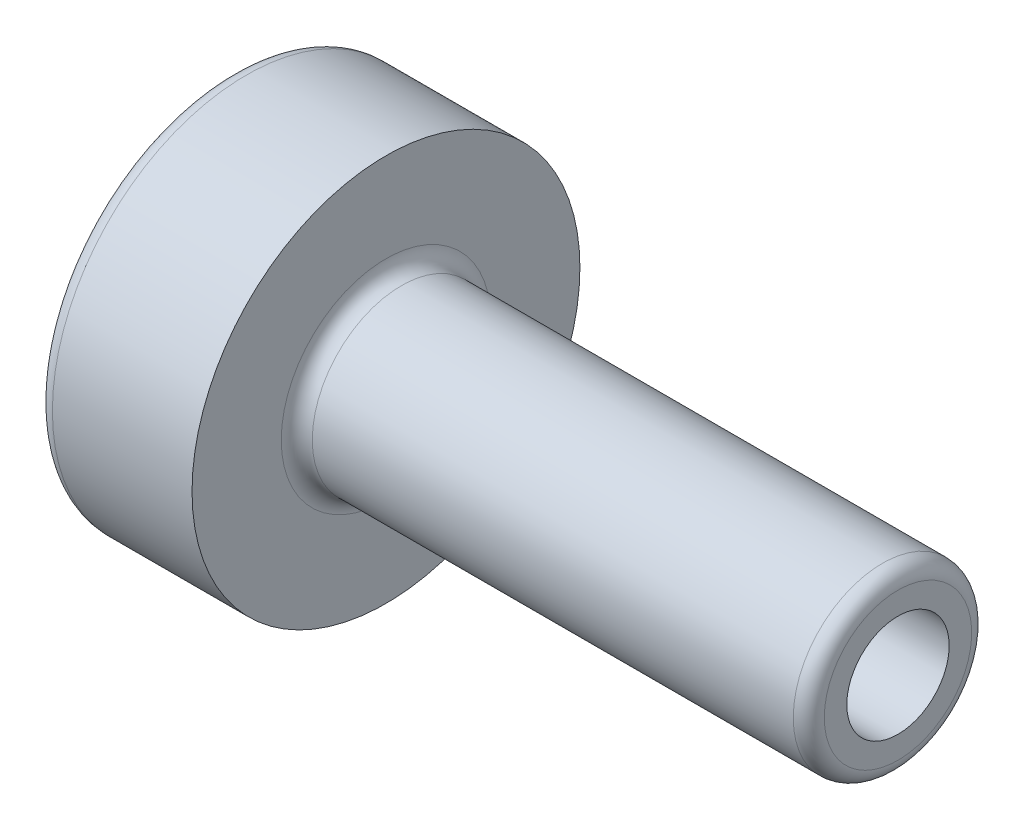
ISO-10303-21;
HEADER;
FILE_DESCRIPTION(('STEP AP214'),'2;1');
FILE_NAME('part.step','',(''),(''),'','','');
FILE_SCHEMA(('AUTOMOTIVE_DESIGN { 1 0 10303 214 1 1 1 1 }'));
ENDSEC;
DATA;
#1=APPLICATION_CONTEXT('core data for automotive mechanical design processes');
#2=APPLICATION_PROTOCOL_DEFINITION('international standard','automotive_design',2000,#1);
#3=PRODUCT_CONTEXT('',#1,'mechanical');
#4=PRODUCT('Part','Part','',(#3));
#5=PRODUCT_RELATED_PRODUCT_CATEGORY('part','',(#4));
#6=PRODUCT_DEFINITION_FORMATION('','',#4);
#7=PRODUCT_DEFINITION_CONTEXT('part definition',#1,'design');
#8=PRODUCT_DEFINITION('design','',#6,#7);
#9=PRODUCT_DEFINITION_SHAPE('','',#8);
#10=(LENGTH_UNIT() NAMED_UNIT(*) SI_UNIT(.MILLI.,.METRE.));
#11=(NAMED_UNIT(*) PLANE_ANGLE_UNIT() SI_UNIT($,.RADIAN.));
#12=(NAMED_UNIT(*) SI_UNIT($,.STERADIAN.) SOLID_ANGLE_UNIT());
#13=UNCERTAINTY_MEASURE_WITH_UNIT(LENGTH_MEASURE(1.E-05),#10,'distance_accuracy_value','');
#14=(GEOMETRIC_REPRESENTATION_CONTEXT(3) GLOBAL_UNCERTAINTY_ASSIGNED_CONTEXT((#13)) GLOBAL_UNIT_ASSIGNED_CONTEXT((#10,
#11,#12)) REPRESENTATION_CONTEXT('',''));
#15=CARTESIAN_POINT('',(0.,0.,0.));
#16=DIRECTION('',(0.,0.,1.));
#17=DIRECTION('',(1.,0.,0.));
#18=AXIS2_PLACEMENT_3D('',#15,#16,#17);
#19=CARTESIAN_POINT('',(27.5,0.,0.));
#20=DIRECTION('',(1.,0.,0.));
#21=DIRECTION('',(0.,1.,0.));
#22=AXIS2_PLACEMENT_3D('',#19,#20,#21);
#23=CYLINDRICAL_SURFACE('',#22,3.3);
#24=CARTESIAN_POINT('',(33.,0.,0.));
#25=DIRECTION('',(-1.,0.,0.));
#26=DIRECTION('',(0.,1.,0.));
#27=AXIS2_PLACEMENT_3D('',#24,#25,#26);
#28=CIRCLE('',#27,3.3);
#29=CARTESIAN_POINT('',(33.,-3.3,0.));
#30=VERTEX_POINT('',#29);
#31=EDGE_CURVE('E143',#30,#30,#28,.T.);
#32=ORIENTED_EDGE('',*,*,#31,.F.);
#33=DIRECTION('',(-1.,0.,0.));
#34=VECTOR('',#33,1.);
#35=CARTESIAN_POINT('',(27.5,-3.3,0.));
#36=LINE('',#35,#34);
#37=CARTESIAN_POINT('',(22.,-3.3,0.));
#38=VERTEX_POINT('',#37);
#39=EDGE_CURVE('E11',#30,#38,#36,.T.);
#40=ORIENTED_EDGE('',*,*,#39,.T.);
#41=CARTESIAN_POINT('',(22.,0.,0.));
#42=DIRECTION('',(1.,0.,0.));
#43=DIRECTION('',(0.,1.,0.));
#44=AXIS2_PLACEMENT_3D('',#41,#42,#43);
#45=CIRCLE('',#44,3.3);
#46=EDGE_CURVE('E127',#38,#38,#45,.T.);
#47=ORIENTED_EDGE('',*,*,#46,.F.);
#48=ORIENTED_EDGE('',*,*,#39,.F.);
#49=EDGE_LOOP('',(#32,#40,#47,#48));
#50=FACE_BOUND('',#49,.T.);
#51=ADVANCED_FACE('F17',(#50),#23,.F.);
#52=CARTESIAN_POINT('',(21.0085799786045,0.,0.));
#53=DIRECTION('',(1.,0.,0.));
#54=DIRECTION('',(0.,1.,0.));
#55=AXIS2_PLACEMENT_3D('',#52,#53,#54);
#56=CONICAL_SURFACE('',#55,1.65,1.02974425867665);
#57=ORIENTED_EDGE('',*,*,#46,.T.);
#58=DIRECTION('',(-0.515038074910054,0.857167300702112,0.));
#59=VECTOR('',#58,1.);
#60=CARTESIAN_POINT('',(21.0085799786045,-1.65,0.));
#61=LINE('',#60,#59);
#62=CARTESIAN_POINT('',(20.0171599572091,0.,0.));
#63=VERTEX_POINT('',#62);
#64=EDGE_CURVE('E27',#38,#63,#61,.T.);
#65=ORIENTED_EDGE('',*,*,#64,.T.);
#66=ORIENTED_EDGE('',*,*,#64,.F.);
#67=EDGE_LOOP('',(#57,#65,#66));
#68=FACE_BOUND('',#67,.T.);
#69=ADVANCED_FACE('F173',(#68),#56,.F.);
#70=CARTESIAN_POINT('',(0.,0.,0.));
#71=DIRECTION('',(-1.,0.,0.));
#72=DIRECTION('',(0.,0.,1.));
#73=AXIS2_PLACEMENT_3D('',#70,#71,#72);
#74=PLANE('',#73);
#75=CARTESIAN_POINT('',(0.,0.,0.));
#76=DIRECTION('',(1.,0.,0.));
#77=DIRECTION('',(0.,-1.,0.));
#78=AXIS2_PLACEMENT_3D('',#75,#76,#77);
#79=CIRCLE('',#78,6.75);
#80=CARTESIAN_POINT('',(0.,0.,6.75));
#81=VERTEX_POINT('',#80);
#82=EDGE_CURVE('E148',#81,#81,#79,.T.);
#83=ORIENTED_EDGE('',*,*,#82,.F.);
#84=EDGE_LOOP('',(#83));
#85=FACE_BOUND('',#84,.T.);
#86=CARTESIAN_POINT('',(0.,0.,0.));
#87=DIRECTION('',(-1.,0.,0.));
#88=DIRECTION('',(0.,0.,1.));
#89=AXIS2_PLACEMENT_3D('',#86,#87,#88);
#90=CIRCLE('',#89,12.5);
#91=CARTESIAN_POINT('',(0.,0.,-12.5));
#92=VERTEX_POINT('',#91);
#93=EDGE_CURVE('E82',#92,#92,#90,.T.);
#94=ORIENTED_EDGE('',*,*,#93,.F.);
#95=EDGE_LOOP('',(#94));
#96=FACE_BOUND('',#95,.T.);
#97=ADVANCED_FACE('F19',(#85,#96),#74,.F.);
#98=CARTESIAN_POINT('',(1.,0.,0.));
#99=DIRECTION('',(1.,0.,0.));
#100=DIRECTION('',(0.,0.,-1.));
#101=AXIS2_PLACEMENT_3D('',#98,#99,#100);
#102=TOROIDAL_SURFACE('',#101,6.75,1.);
#103=ORIENTED_EDGE('',*,*,#82,.T.);
#104=CARTESIAN_POINT('',(1.,0.,6.75));
#105=DIRECTION('',(0.,-1.,0.));
#106=DIRECTION('',(0.,0.,1.));
#107=AXIS2_PLACEMENT_3D('',#104,#105,#106);
#108=CIRCLE('',#107,1.);
#109=CARTESIAN_POINT('',(1.,0.,5.75));
#110=VERTEX_POINT('',#109);
#111=EDGE_CURVE('E21',#81,#110,#108,.T.);
#112=ORIENTED_EDGE('',*,*,#111,.T.);
#113=CARTESIAN_POINT('',(1.,0.,0.));
#114=DIRECTION('',(-1.,0.,0.));
#115=DIRECTION('',(0.,-1.,0.));
#116=AXIS2_PLACEMENT_3D('',#113,#114,#115);
#117=CIRCLE('',#116,5.75);
#118=CARTESIAN_POINT('',(1.,-5.75,0.));
#119=VERTEX_POINT('',#118);
#120=EDGE_CURVE('E108',#110,#119,#117,.T.);
#121=ORIENTED_EDGE('',*,*,#120,.T.);
#122=CARTESIAN_POINT('',(1.,0.,0.));
#123=DIRECTION('',(-1.,0.,0.));
#124=DIRECTION('',(0.,-1.,0.));
#125=AXIS2_PLACEMENT_3D('',#122,#123,#124);
#126=CIRCLE('',#125,5.75);
#127=EDGE_CURVE('E105',#119,#110,#126,.T.);
#128=ORIENTED_EDGE('',*,*,#127,.T.);
#129=ORIENTED_EDGE('',*,*,#111,.F.);
#130=EDGE_LOOP('',(#103,#112,#121,#128,#129));
#131=FACE_BOUND('',#130,.T.);
#132=ADVANCED_FACE('F161',(#131),#102,.F.);
#133=CARTESIAN_POINT('',(33.,0.,0.));
#134=DIRECTION('',(1.,0.,0.));
#135=DIRECTION('',(0.,1.,0.));
#136=AXIS2_PLACEMENT_3D('',#133,#134,#135);
#137=PLANE('',#136);
#138=ORIENTED_EDGE('',*,*,#31,.T.);
#139=EDGE_LOOP('',(#138));
#140=FACE_BOUND('',#139,.T.);
#141=CARTESIAN_POINT('',(33.,0.,0.));
#142=DIRECTION('',(-1.,0.,0.));
#143=DIRECTION('',(0.,-1.,0.));
#144=AXIS2_PLACEMENT_3D('',#141,#142,#143);
#145=CIRCLE('',#144,4.75);
#146=CARTESIAN_POINT('',(33.,0.,4.75));
#147=VERTEX_POINT('',#146);
#148=EDGE_CURVE('E123',#147,#147,#145,.T.);
#149=ORIENTED_EDGE('',*,*,#148,.F.);
#150=EDGE_LOOP('',(#149));
#151=FACE_BOUND('',#150,.T.);
#152=ADVANCED_FACE('F163',(#140,#151),#137,.T.);
#153=CARTESIAN_POINT('',(0.,0.,0.));
#154=DIRECTION('',(1.,0.,0.));
#155=DIRECTION('',(0.,1.,0.));
#156=AXIS2_PLACEMENT_3D('',#153,#154,#155);
#157=CYLINDRICAL_SURFACE('',#156,5.75);
#158=CARTESIAN_POINT('',(32.,0.,0.));
#159=DIRECTION('',(1.,0.,0.));
#160=DIRECTION('',(0.,-1.,0.));
#161=AXIS2_PLACEMENT_3D('',#158,#159,#160);
#162=CIRCLE('',#161,5.75);
#163=CARTESIAN_POINT('',(32.,-5.75,0.));
#164=VERTEX_POINT('',#163);
#165=CARTESIAN_POINT('',(32.,0.,5.75));
#166=VERTEX_POINT('',#165);
#167=EDGE_CURVE('E109',#164,#166,#162,.T.);
#168=ORIENTED_EDGE('',*,*,#167,.F.);
#169=DIRECTION('',(-1.,0.,0.));
#170=VECTOR('',#169,1.);
#171=CARTESIAN_POINT('',(0.,-5.75,0.));
#172=LINE('',#171,#170);
#173=EDGE_CURVE('E97',#164,#119,#172,.T.);
#174=ORIENTED_EDGE('',*,*,#173,.T.);
#175=ORIENTED_EDGE('',*,*,#120,.F.);
#176=ORIENTED_EDGE('',*,*,#127,.F.);
#177=ORIENTED_EDGE('',*,*,#173,.F.);
#178=CARTESIAN_POINT('',(32.,0.,0.));
#179=DIRECTION('',(1.,0.,0.));
#180=DIRECTION('',(0.,-1.,0.));
#181=AXIS2_PLACEMENT_3D('',#178,#179,#180);
#182=CIRCLE('',#181,5.75);
#183=EDGE_CURVE('E101',#166,#164,#182,.T.);
#184=ORIENTED_EDGE('',*,*,#183,.F.);
#185=EDGE_LOOP('',(#168,#174,#175,#176,#177,#184));
#186=FACE_BOUND('',#185,.T.);
#187=ADVANCED_FACE('F99',(#186),#157,.T.);
#188=CARTESIAN_POINT('',(32.,0.,0.));
#189=DIRECTION('',(1.,0.,0.));
#190=DIRECTION('',(0.,0.,-1.));
#191=AXIS2_PLACEMENT_3D('',#188,#189,#190);
#192=TOROIDAL_SURFACE('',#191,4.75,1.);
#193=ORIENTED_EDGE('',*,*,#148,.T.);
#194=CARTESIAN_POINT('',(32.,0.,4.75));
#195=DIRECTION('',(0.,-1.,0.));
#196=DIRECTION('',(0.,0.,1.));
#197=AXIS2_PLACEMENT_3D('',#194,#195,#196);
#198=CIRCLE('',#197,1.);
#199=EDGE_CURVE('E116',#147,#166,#198,.T.);
#200=ORIENTED_EDGE('',*,*,#199,.T.);
#201=ORIENTED_EDGE('',*,*,#183,.T.);
#202=ORIENTED_EDGE('',*,*,#167,.T.);
#203=ORIENTED_EDGE('',*,*,#199,.F.);
#204=EDGE_LOOP('',(#193,#200,#201,#202,#203));
#205=FACE_BOUND('',#204,.T.);
#206=ADVANCED_FACE('F115',(#205),#192,.T.);
#207=CARTESIAN_POINT('',(-10.,0.,0.));
#208=DIRECTION('',(-1.,0.,0.));
#209=DIRECTION('',(0.,0.,1.));
#210=AXIS2_PLACEMENT_3D('',#207,#208,#209);
#211=PLANE('',#210);
#212=CARTESIAN_POINT('',(-10.,0.,0.));
#213=DIRECTION('',(1.,0.,0.));
#214=DIRECTION('',(0.,0.,-1.));
#215=AXIS2_PLACEMENT_3D('',#212,#213,#214);
#216=CIRCLE('',#215,11.5);
#217=CARTESIAN_POINT('',(-10.,0.,-11.5));
#218=VERTEX_POINT('',#217);
#219=EDGE_CURVE('E139',#218,#218,#216,.T.);
#220=ORIENTED_EDGE('',*,*,#219,.F.);
#221=EDGE_LOOP('',(#220));
#222=FACE_BOUND('',#221,.T.);
#223=ADVANCED_FACE('F184',(#222),#211,.T.);
#224=CARTESIAN_POINT('',(0.,0.,0.));
#225=DIRECTION('',(-1.,0.,0.));
#226=DIRECTION('',(0.,0.,1.));
#227=AXIS2_PLACEMENT_3D('',#224,#225,#226);
#228=CYLINDRICAL_SURFACE('',#227,12.5);
#229=CARTESIAN_POINT('',(-9.,0.,0.));
#230=DIRECTION('',(-1.,0.,0.));
#231=DIRECTION('',(0.,0.,-1.));
#232=AXIS2_PLACEMENT_3D('',#229,#230,#231);
#233=CIRCLE('',#232,12.5);
#234=CARTESIAN_POINT('',(-9.,0.,-12.5));
#235=VERTEX_POINT('',#234);
#236=EDGE_CURVE('E132',#235,#235,#233,.T.);
#237=ORIENTED_EDGE('',*,*,#236,.F.);
#238=DIRECTION('',(1.,0.,0.));
#239=VECTOR('',#238,1.);
#240=CARTESIAN_POINT('',(0.,0.,-12.5));
#241=LINE('',#240,#239);
#242=EDGE_CURVE('E76',#235,#92,#241,.T.);
#243=ORIENTED_EDGE('',*,*,#242,.T.);
#244=ORIENTED_EDGE('',*,*,#93,.T.);
#245=ORIENTED_EDGE('',*,*,#242,.F.);
#246=EDGE_LOOP('',(#237,#243,#244,#245));
#247=FACE_BOUND('',#246,.T.);
#248=ADVANCED_FACE('F188',(#247),#228,.T.);
#249=CARTESIAN_POINT('',(-9.,0.,0.));
#250=DIRECTION('',(-1.,0.,0.));
#251=DIRECTION('',(0.,0.,1.));
#252=AXIS2_PLACEMENT_3D('',#249,#250,#251);
#253=TOROIDAL_SURFACE('',#252,11.5,1.);
#254=ORIENTED_EDGE('',*,*,#219,.T.);
#255=CARTESIAN_POINT('',(-9.,0.,-11.5));
#256=DIRECTION('',(0.,-1.,0.));
#257=DIRECTION('',(0.,0.,-1.));
#258=AXIS2_PLACEMENT_3D('',#255,#256,#257);
#259=CIRCLE('',#258,1.);
#260=EDGE_CURVE('E135',#218,#235,#259,.T.);
#261=ORIENTED_EDGE('',*,*,#260,.T.);
#262=ORIENTED_EDGE('',*,*,#236,.T.);
#263=ORIENTED_EDGE('',*,*,#260,.F.);
#264=EDGE_LOOP('',(#254,#261,#262,#263));
#265=FACE_BOUND('',#264,.T.);
#266=ADVANCED_FACE('F191',(#265),#253,.T.);
#267=CLOSED_SHELL('',(#51,#69,#97,#132,#152,#187,#206,#223,#248,#266));
#268=MANIFOLD_SOLID_BREP('B1',#267);
#269=ADVANCED_BREP_SHAPE_REPRESENTATION('',(#18,#268),#14);
#270=SHAPE_DEFINITION_REPRESENTATION(#9,#269);
ENDSEC;
END-ISO-10303-21;
